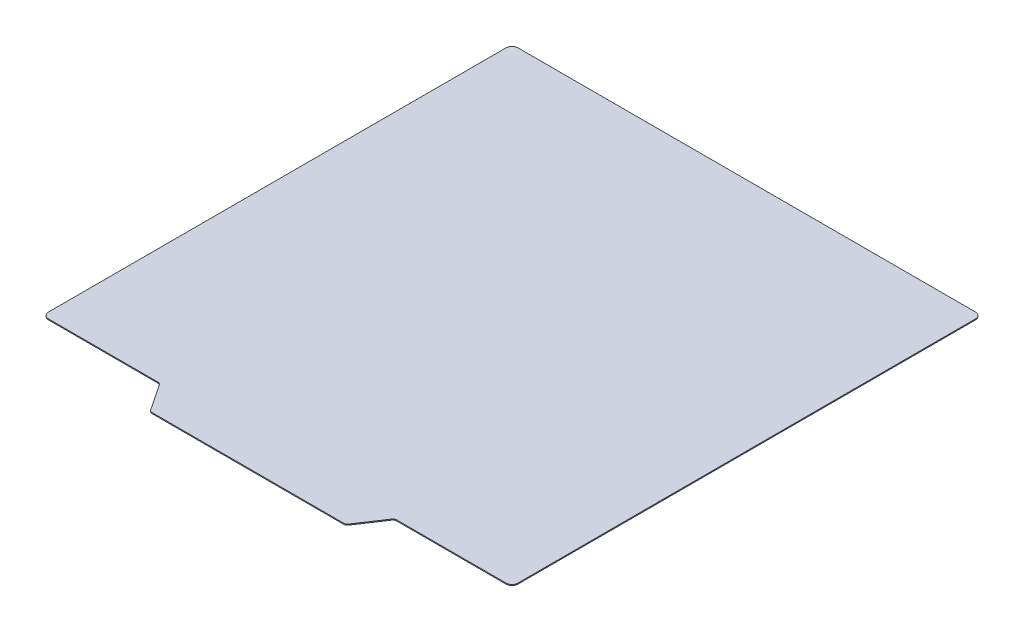
ISO-10303-21;
HEADER;
FILE_DESCRIPTION(('STEP AP214'),'2;1');
FILE_NAME('part.step','',(''),(''),'','','');
FILE_SCHEMA(('AUTOMOTIVE_DESIGN { 1 0 10303 214 1 1 1 1 }'));
ENDSEC;
DATA;
#1=APPLICATION_CONTEXT('core data for automotive mechanical design processes');
#2=APPLICATION_PROTOCOL_DEFINITION('international standard','automotive_design',2000,#1);
#3=PRODUCT_CONTEXT('',#1,'mechanical');
#4=PRODUCT('Part','Part','',(#3));
#5=PRODUCT_RELATED_PRODUCT_CATEGORY('part','',(#4));
#6=PRODUCT_DEFINITION_FORMATION('','',#4);
#7=PRODUCT_DEFINITION_CONTEXT('part definition',#1,'design');
#8=PRODUCT_DEFINITION('design','',#6,#7);
#9=PRODUCT_DEFINITION_SHAPE('','',#8);
#10=(LENGTH_UNIT() NAMED_UNIT(*) SI_UNIT(.MILLI.,.METRE.));
#11=(NAMED_UNIT(*) PLANE_ANGLE_UNIT() SI_UNIT($,.RADIAN.));
#12=(NAMED_UNIT(*) SI_UNIT($,.STERADIAN.) SOLID_ANGLE_UNIT());
#13=UNCERTAINTY_MEASURE_WITH_UNIT(LENGTH_MEASURE(1.E-05),#10,'distance_accuracy_value','');
#14=(GEOMETRIC_REPRESENTATION_CONTEXT(3) GLOBAL_UNCERTAINTY_ASSIGNED_CONTEXT((#13)) GLOBAL_UNIT_ASSIGNED_CONTEXT((#10,
#11,#12)) REPRESENTATION_CONTEXT('',''));
#15=CARTESIAN_POINT('',(0.,0.,0.));
#16=DIRECTION('',(0.,0.,1.));
#17=DIRECTION('',(1.,0.,0.));
#18=AXIS2_PLACEMENT_3D('',#15,#16,#17);
#19=CARTESIAN_POINT('',(-117.,0.5,120.));
#20=DIRECTION('',(0.,0.,-1.));
#21=DIRECTION('',(-1.,0.,0.));
#22=AXIS2_PLACEMENT_3D('',#19,#20,#21);
#23=PLANE('',#22);
#24=DIRECTION('',(1.,0.,0.));
#25=VECTOR('',#24,1.);
#26=CARTESIAN_POINT('',(-117.,0.5,120.));
#27=LINE('',#26,#25);
#28=CARTESIAN_POINT('',(61.070367516976,0.5,120.));
#29=VERTEX_POINT('',#28);
#30=CARTESIAN_POINT('',(117.,0.5,120.));
#31=VERTEX_POINT('',#30);
#32=EDGE_CURVE('E158',#29,#31,#27,.T.);
#33=ORIENTED_EDGE('',*,*,#32,.F.);
#34=DIRECTION('',(0.,1.,0.));
#35=VECTOR('',#34,1.);
#36=CARTESIAN_POINT('',(61.070367516976,0.5,120.));
#37=LINE('',#36,#35);
#38=CARTESIAN_POINT('',(61.070367516976,0.,120.));
#39=VERTEX_POINT('',#38);
#40=EDGE_CURVE('E204',#29,#39,#37,.F.);
#41=ORIENTED_EDGE('',*,*,#40,.T.);
#42=DIRECTION('',(1.,0.,0.));
#43=VECTOR('',#42,1.);
#44=CARTESIAN_POINT('',(-117.,0.,120.));
#45=LINE('',#44,#43);
#46=CARTESIAN_POINT('',(117.,0.,120.));
#47=VERTEX_POINT('',#46);
#48=EDGE_CURVE('E224',#39,#47,#45,.T.);
#49=ORIENTED_EDGE('',*,*,#48,.T.);
#50=DIRECTION('',(0.,-1.,0.));
#51=VECTOR('',#50,1.);
#52=CARTESIAN_POINT('',(117.,0.5,120.));
#53=LINE('',#52,#51);
#54=EDGE_CURVE('E175',#31,#47,#53,.T.);
#55=ORIENTED_EDGE('',*,*,#54,.F.);
#56=EDGE_LOOP('',(#33,#41,#49,#55));
#57=FACE_BOUND('',#56,.T.);
#58=ADVANCED_FACE('F32',(#57),#23,.F.);
#59=CARTESIAN_POINT('',(-117.,0.5,117.));
#60=DIRECTION('',(0.,-1.,0.));
#61=DIRECTION('',(0.,0.,-1.));
#62=AXIS2_PLACEMENT_3D('',#59,#60,#61);
#63=CYLINDRICAL_SURFACE('',#62,2.9999999999999);
#64=CARTESIAN_POINT('',(-117.,0.,117.));
#65=DIRECTION('',(0.,1.,0.));
#66=DIRECTION('',(0.,0.,1.));
#67=AXIS2_PLACEMENT_3D('',#64,#65,#66);
#68=CIRCLE('',#67,2.9999999999999);
#69=CARTESIAN_POINT('',(-120.,0.,117.));
#70=VERTEX_POINT('',#69);
#71=CARTESIAN_POINT('',(-117.,0.,120.));
#72=VERTEX_POINT('',#71);
#73=EDGE_CURVE('E173',#70,#72,#68,.T.);
#74=ORIENTED_EDGE('',*,*,#73,.T.);
#75=DIRECTION('',(0.,-1.,0.));
#76=VECTOR('',#75,1.);
#77=CARTESIAN_POINT('',(-117.,0.5,120.));
#78=LINE('',#77,#76);
#79=CARTESIAN_POINT('',(-117.,0.5,120.));
#80=VERTEX_POINT('',#79);
#81=EDGE_CURVE('E152',#80,#72,#78,.T.);
#82=ORIENTED_EDGE('',*,*,#81,.F.);
#83=CARTESIAN_POINT('',(-117.,0.5,117.));
#84=DIRECTION('',(0.,1.,0.));
#85=DIRECTION('',(0.,0.,1.));
#86=AXIS2_PLACEMENT_3D('',#83,#84,#85);
#87=CIRCLE('',#86,2.9999999999999);
#88=CARTESIAN_POINT('',(-120.,0.5,117.));
#89=VERTEX_POINT('',#88);
#90=EDGE_CURVE('E161',#89,#80,#87,.T.);
#91=ORIENTED_EDGE('',*,*,#90,.F.);
#92=DIRECTION('',(0.,-1.,0.));
#93=VECTOR('',#92,1.);
#94=CARTESIAN_POINT('',(-120.,0.5,117.));
#95=LINE('',#94,#93);
#96=EDGE_CURVE('E248',#89,#70,#95,.T.);
#97=ORIENTED_EDGE('',*,*,#96,.T.);
#98=EDGE_LOOP('',(#74,#82,#91,#97));
#99=FACE_BOUND('',#98,.T.);
#100=ADVANCED_FACE('F171',(#99),#63,.T.);
#101=CARTESIAN_POINT('',(-61.070367516976,0.,120.));
#102=VERTEX_POINT('',#101);
#103=EDGE_CURVE('E250',#72,#102,#45,.T.);
#104=ORIENTED_EDGE('',*,*,#103,.T.);
#105=DIRECTION('',(0.,1.,0.));
#106=VECTOR('',#105,1.);
#107=CARTESIAN_POINT('',(-61.070367516976,0.5,120.));
#108=LINE('',#107,#106);
#109=CARTESIAN_POINT('',(-61.070367516976,0.5,120.));
#110=VERTEX_POINT('',#109);
#111=EDGE_CURVE('E155',#102,#110,#108,.T.);
#112=ORIENTED_EDGE('',*,*,#111,.T.);
#113=EDGE_CURVE('E148',#80,#110,#27,.T.);
#114=ORIENTED_EDGE('',*,*,#113,.F.);
#115=ORIENTED_EDGE('',*,*,#81,.T.);
#116=EDGE_LOOP('',(#104,#112,#114,#115));
#117=FACE_BOUND('',#116,.T.);
#118=ADVANCED_FACE('F150',(#117),#23,.F.);
#119=CARTESIAN_POINT('',(117.,0.5,117.));
#120=DIRECTION('',(0.,-1.,0.));
#121=DIRECTION('',(0.,0.,-1.));
#122=AXIS2_PLACEMENT_3D('',#119,#120,#121);
#123=CYLINDRICAL_SURFACE('',#122,2.9999999999999);
#124=CARTESIAN_POINT('',(117.,0.,117.));
#125=DIRECTION('',(0.,1.,0.));
#126=DIRECTION('',(0.,0.,1.));
#127=AXIS2_PLACEMENT_3D('',#124,#125,#126);
#128=CIRCLE('',#127,2.9999999999999);
#129=CARTESIAN_POINT('',(120.,0.,117.));
#130=VERTEX_POINT('',#129);
#131=EDGE_CURVE('E252',#47,#130,#128,.T.);
#132=ORIENTED_EDGE('',*,*,#131,.T.);
#133=DIRECTION('',(0.,-1.,0.));
#134=VECTOR('',#133,1.);
#135=CARTESIAN_POINT('',(120.,0.5,117.));
#136=LINE('',#135,#134);
#137=CARTESIAN_POINT('',(120.,0.5,117.));
#138=VERTEX_POINT('',#137);
#139=EDGE_CURVE('E180',#138,#130,#136,.T.);
#140=ORIENTED_EDGE('',*,*,#139,.F.);
#141=CARTESIAN_POINT('',(117.,0.5,117.));
#142=DIRECTION('',(0.,1.,0.));
#143=DIRECTION('',(0.,0.,1.));
#144=AXIS2_PLACEMENT_3D('',#141,#142,#143);
#145=CIRCLE('',#144,2.9999999999999);
#146=EDGE_CURVE('E157',#31,#138,#145,.T.);
#147=ORIENTED_EDGE('',*,*,#146,.F.);
#148=ORIENTED_EDGE('',*,*,#54,.T.);
#149=EDGE_LOOP('',(#132,#140,#147,#148));
#150=FACE_BOUND('',#149,.T.);
#151=ADVANCED_FACE('F296',(#150),#123,.T.);
#152=CARTESIAN_POINT('',(120.,0.5,117.));
#153=DIRECTION('',(-1.,0.,0.));
#154=DIRECTION('',(0.,0.,1.));
#155=AXIS2_PLACEMENT_3D('',#152,#153,#154);
#156=PLANE('',#155);
#157=DIRECTION('',(0.,0.,-1.));
#158=VECTOR('',#157,1.);
#159=CARTESIAN_POINT('',(120.,0.,117.));
#160=LINE('',#159,#158);
#161=CARTESIAN_POINT('',(120.,0.,-117.));
#162=VERTEX_POINT('',#161);
#163=EDGE_CURVE('E254',#130,#162,#160,.T.);
#164=ORIENTED_EDGE('',*,*,#163,.T.);
#165=DIRECTION('',(0.,-1.,0.));
#166=VECTOR('',#165,1.);
#167=CARTESIAN_POINT('',(120.,0.5,-117.));
#168=LINE('',#167,#166);
#169=CARTESIAN_POINT('',(120.,0.5,-117.));
#170=VERTEX_POINT('',#169);
#171=EDGE_CURVE('E273',#170,#162,#168,.T.);
#172=ORIENTED_EDGE('',*,*,#171,.F.);
#173=DIRECTION('',(0.,0.,-1.));
#174=VECTOR('',#173,1.);
#175=CARTESIAN_POINT('',(120.,0.5,117.));
#176=LINE('',#175,#174);
#177=EDGE_CURVE('E239',#138,#170,#176,.T.);
#178=ORIENTED_EDGE('',*,*,#177,.F.);
#179=ORIENTED_EDGE('',*,*,#139,.T.);
#180=EDGE_LOOP('',(#164,#172,#178,#179));
#181=FACE_BOUND('',#180,.T.);
#182=ADVANCED_FACE('F280',(#181),#156,.F.);
#183=CARTESIAN_POINT('',(117.,0.5,-117.));
#184=DIRECTION('',(0.,-1.,0.));
#185=DIRECTION('',(0.,0.,-1.));
#186=AXIS2_PLACEMENT_3D('',#183,#184,#185);
#187=CYLINDRICAL_SURFACE('',#186,2.9999999999999);
#188=CARTESIAN_POINT('',(117.,0.,-117.));
#189=DIRECTION('',(0.,1.,0.));
#190=DIRECTION('',(0.,0.,1.));
#191=AXIS2_PLACEMENT_3D('',#188,#189,#190);
#192=CIRCLE('',#191,2.9999999999999);
#193=CARTESIAN_POINT('',(117.,0.,-120.));
#194=VERTEX_POINT('',#193);
#195=EDGE_CURVE('E256',#162,#194,#192,.T.);
#196=ORIENTED_EDGE('',*,*,#195,.T.);
#197=DIRECTION('',(0.,-1.,0.));
#198=VECTOR('',#197,1.);
#199=CARTESIAN_POINT('',(117.,0.5,-120.));
#200=LINE('',#199,#198);
#201=CARTESIAN_POINT('',(117.,0.5,-120.));
#202=VERTEX_POINT('',#201);
#203=EDGE_CURVE('E270',#202,#194,#200,.T.);
#204=ORIENTED_EDGE('',*,*,#203,.F.);
#205=CARTESIAN_POINT('',(117.,0.5,-117.));
#206=DIRECTION('',(0.,1.,0.));
#207=DIRECTION('',(0.,0.,1.));
#208=AXIS2_PLACEMENT_3D('',#205,#206,#207);
#209=CIRCLE('',#208,2.9999999999999);
#210=EDGE_CURVE('E241',#170,#202,#209,.T.);
#211=ORIENTED_EDGE('',*,*,#210,.F.);
#212=ORIENTED_EDGE('',*,*,#171,.T.);
#213=EDGE_LOOP('',(#196,#204,#211,#212));
#214=FACE_BOUND('',#213,.T.);
#215=ADVANCED_FACE('F288',(#214),#187,.T.);
#216=CARTESIAN_POINT('',(117.,0.5,-120.));
#217=DIRECTION('',(0.,0.,1.));
#218=DIRECTION('',(1.,0.,0.));
#219=AXIS2_PLACEMENT_3D('',#216,#217,#218);
#220=PLANE('',#219);
#221=DIRECTION('',(-1.,0.,0.));
#222=VECTOR('',#221,1.);
#223=CARTESIAN_POINT('',(117.,0.,-120.));
#224=LINE('',#223,#222);
#225=CARTESIAN_POINT('',(-117.,0.,-120.));
#226=VERTEX_POINT('',#225);
#227=EDGE_CURVE('E258',#194,#226,#224,.T.);
#228=ORIENTED_EDGE('',*,*,#227,.T.);
#229=DIRECTION('',(0.,-1.,0.));
#230=VECTOR('',#229,1.);
#231=CARTESIAN_POINT('',(-117.,0.5,-120.));
#232=LINE('',#231,#230);
#233=CARTESIAN_POINT('',(-117.,0.5,-120.));
#234=VERTEX_POINT('',#233);
#235=EDGE_CURVE('E267',#234,#226,#232,.T.);
#236=ORIENTED_EDGE('',*,*,#235,.F.);
#237=DIRECTION('',(-1.,0.,0.));
#238=VECTOR('',#237,1.);
#239=CARTESIAN_POINT('',(117.,0.5,-120.));
#240=LINE('',#239,#238);
#241=EDGE_CURVE('E243',#202,#234,#240,.T.);
#242=ORIENTED_EDGE('',*,*,#241,.F.);
#243=ORIENTED_EDGE('',*,*,#203,.T.);
#244=EDGE_LOOP('',(#228,#236,#242,#243));
#245=FACE_BOUND('',#244,.T.);
#246=ADVANCED_FACE('F292',(#245),#220,.F.);
#247=CARTESIAN_POINT('',(-117.,0.5,-117.));
#248=DIRECTION('',(0.,-1.,0.));
#249=DIRECTION('',(0.,0.,-1.));
#250=AXIS2_PLACEMENT_3D('',#247,#248,#249);
#251=CYLINDRICAL_SURFACE('',#250,2.9999999999999);
#252=CARTESIAN_POINT('',(-117.,0.,-117.));
#253=DIRECTION('',(0.,1.,0.));
#254=DIRECTION('',(0.,0.,1.));
#255=AXIS2_PLACEMENT_3D('',#252,#253,#254);
#256=CIRCLE('',#255,2.9999999999999);
#257=CARTESIAN_POINT('',(-120.,0.,-117.));
#258=VERTEX_POINT('',#257);
#259=EDGE_CURVE('E260',#226,#258,#256,.T.);
#260=ORIENTED_EDGE('',*,*,#259,.T.);
#261=DIRECTION('',(0.,-1.,0.));
#262=VECTOR('',#261,1.);
#263=CARTESIAN_POINT('',(-120.,0.5,-117.));
#264=LINE('',#263,#262);
#265=CARTESIAN_POINT('',(-120.,0.5,-117.));
#266=VERTEX_POINT('',#265);
#267=EDGE_CURVE('E264',#266,#258,#264,.T.);
#268=ORIENTED_EDGE('',*,*,#267,.F.);
#269=CARTESIAN_POINT('',(-117.,0.5,-117.));
#270=DIRECTION('',(0.,1.,0.));
#271=DIRECTION('',(0.,0.,1.));
#272=AXIS2_PLACEMENT_3D('',#269,#270,#271);
#273=CIRCLE('',#272,2.9999999999999);
#274=EDGE_CURVE('E245',#234,#266,#273,.T.);
#275=ORIENTED_EDGE('',*,*,#274,.F.);
#276=ORIENTED_EDGE('',*,*,#235,.T.);
#277=EDGE_LOOP('',(#260,#268,#275,#276));
#278=FACE_BOUND('',#277,.T.);
#279=ADVANCED_FACE('F352',(#278),#251,.T.);
#280=CARTESIAN_POINT('',(-120.,0.5,-117.));
#281=DIRECTION('',(1.,0.,0.));
#282=DIRECTION('',(0.,0.,-1.));
#283=AXIS2_PLACEMENT_3D('',#280,#281,#282);
#284=PLANE('',#283);
#285=DIRECTION('',(0.,0.,1.));
#286=VECTOR('',#285,1.);
#287=CARTESIAN_POINT('',(-120.,0.,-117.));
#288=LINE('',#287,#286);
#289=EDGE_CURVE('E169',#258,#70,#288,.T.);
#290=ORIENTED_EDGE('',*,*,#289,.T.);
#291=ORIENTED_EDGE('',*,*,#96,.F.);
#292=DIRECTION('',(0.,0.,1.));
#293=VECTOR('',#292,1.);
#294=CARTESIAN_POINT('',(-120.,0.5,-117.));
#295=LINE('',#294,#293);
#296=EDGE_CURVE('E165',#266,#89,#295,.T.);
#297=ORIENTED_EDGE('',*,*,#296,.F.);
#298=ORIENTED_EDGE('',*,*,#267,.T.);
#299=EDGE_LOOP('',(#290,#291,#297,#298));
#300=FACE_BOUND('',#299,.T.);
#301=ADVANCED_FACE('F347',(#300),#284,.F.);
#302=CARTESIAN_POINT('',(-117.,0.5,117.));
#303=DIRECTION('',(0.,1.,0.));
#304=DIRECTION('',(0.,0.,1.));
#305=AXIS2_PLACEMENT_3D('',#302,#303,#304);
#306=PLANE('',#305);
#307=DIRECTION('',(0.554700196225229,0.,0.832050294337844));
#308=VECTOR('',#307,1.);
#309=CARTESIAN_POINT('',(-60.,0.5,120.));
#310=LINE('',#309,#308);
#311=CARTESIAN_POINT('',(-59.4062669283003,0.5,120.89059960755));
#312=VERTEX_POINT('',#311);
#313=CARTESIAN_POINT('',(-50.5937330716997,0.5,134.10940039245));
#314=VERTEX_POINT('',#313);
#315=EDGE_CURVE('E232',#312,#314,#310,.T.);
#316=ORIENTED_EDGE('',*,*,#315,.T.);
#317=CARTESIAN_POINT('',(-48.929632483024,0.5,133.));
#318=DIRECTION('',(0.,1.,0.));
#319=DIRECTION('',(0.,0.,1.));
#320=AXIS2_PLACEMENT_3D('',#317,#318,#319);
#321=CIRCLE('',#320,2.);
#322=CARTESIAN_POINT('',(-48.929632483024,0.5,135.));
#323=VERTEX_POINT('',#322);
#324=EDGE_CURVE('E188',#314,#323,#321,.T.);
#325=ORIENTED_EDGE('',*,*,#324,.T.);
#326=DIRECTION('',(1.,0.,0.));
#327=VECTOR('',#326,1.);
#328=CARTESIAN_POINT('',(-50.,0.5,135.));
#329=LINE('',#328,#327);
#330=CARTESIAN_POINT('',(48.929632483024,0.5,135.));
#331=VERTEX_POINT('',#330);
#332=EDGE_CURVE('E234',#323,#331,#329,.T.);
#333=ORIENTED_EDGE('',*,*,#332,.T.);
#334=CARTESIAN_POINT('',(48.929632483024,0.5,133.));
#335=DIRECTION('',(0.,1.,0.));
#336=DIRECTION('',(0.,0.,1.));
#337=AXIS2_PLACEMENT_3D('',#334,#335,#336);
#338=CIRCLE('',#337,2.);
#339=CARTESIAN_POINT('',(50.5937330716997,0.5,134.10940039245));
#340=VERTEX_POINT('',#339);
#341=EDGE_CURVE('E186',#331,#340,#338,.T.);
#342=ORIENTED_EDGE('',*,*,#341,.T.);
#343=DIRECTION('',(0.554700196225229,0.,-0.832050294337844));
#344=VECTOR('',#343,1.);
#345=CARTESIAN_POINT('',(60.,0.5,120.));
#346=LINE('',#345,#344);
#347=CARTESIAN_POINT('',(59.4062669283003,0.5,120.890599607549));
#348=VERTEX_POINT('',#347);
#349=EDGE_CURVE('E211',#340,#348,#346,.T.);
#350=ORIENTED_EDGE('',*,*,#349,.T.);
#351=CARTESIAN_POINT('',(61.070367516976,0.5,122.));
#352=DIRECTION('',(0.,1.,0.));
#353=DIRECTION('',(0.,0.,1.));
#354=AXIS2_PLACEMENT_3D('',#351,#352,#353);
#355=CIRCLE('',#354,2.);
#356=EDGE_CURVE('E40',#348,#29,#355,.F.);
#357=ORIENTED_EDGE('',*,*,#356,.T.);
#358=ORIENTED_EDGE('',*,*,#32,.T.);
#359=ORIENTED_EDGE('',*,*,#146,.T.);
#360=ORIENTED_EDGE('',*,*,#177,.T.);
#361=ORIENTED_EDGE('',*,*,#210,.T.);
#362=ORIENTED_EDGE('',*,*,#241,.T.);
#363=ORIENTED_EDGE('',*,*,#274,.T.);
#364=ORIENTED_EDGE('',*,*,#296,.T.);
#365=ORIENTED_EDGE('',*,*,#90,.T.);
#366=ORIENTED_EDGE('',*,*,#113,.T.);
#367=CARTESIAN_POINT('',(-61.070367516976,0.5,122.));
#368=DIRECTION('',(0.,1.,0.));
#369=DIRECTION('',(0.,0.,1.));
#370=AXIS2_PLACEMENT_3D('',#367,#368,#369);
#371=CIRCLE('',#370,2.);
#372=EDGE_CURVE('E206',#110,#312,#371,.F.);
#373=ORIENTED_EDGE('',*,*,#372,.T.);
#374=EDGE_LOOP('',(#316,#325,#333,#342,#350,#357,#358,#359,#360,#361,#362,#363,#364,#365,#366,#373));
#375=FACE_BOUND('',#374,.T.);
#376=ADVANCED_FACE('F163',(#375),#306,.T.);
#377=CARTESIAN_POINT('',(-117.,0.,117.));
#378=DIRECTION('',(0.,1.,0.));
#379=DIRECTION('',(0.,0.,1.));
#380=AXIS2_PLACEMENT_3D('',#377,#378,#379);
#381=PLANE('',#380);
#382=DIRECTION('',(-1.,0.,0.));
#383=VECTOR('',#382,1.);
#384=CARTESIAN_POINT('',(-50.,0.,135.));
#385=LINE('',#384,#383);
#386=CARTESIAN_POINT('',(48.929632483024,0.,135.));
#387=VERTEX_POINT('',#386);
#388=CARTESIAN_POINT('',(-48.929632483024,0.,135.));
#389=VERTEX_POINT('',#388);
#390=EDGE_CURVE('E227',#387,#389,#385,.T.);
#391=ORIENTED_EDGE('',*,*,#390,.T.);
#392=CARTESIAN_POINT('',(-48.929632483024,0.,133.));
#393=DIRECTION('',(0.,1.,0.));
#394=DIRECTION('',(0.,0.,1.));
#395=AXIS2_PLACEMENT_3D('',#392,#393,#394);
#396=CIRCLE('',#395,2.);
#397=CARTESIAN_POINT('',(-50.5937330716997,0.,134.10940039245));
#398=VERTEX_POINT('',#397);
#399=EDGE_CURVE('E197',#389,#398,#396,.F.);
#400=ORIENTED_EDGE('',*,*,#399,.T.);
#401=DIRECTION('',(-0.554700196225229,0.,-0.832050294337844));
#402=VECTOR('',#401,1.);
#403=CARTESIAN_POINT('',(-60.,0.,120.));
#404=LINE('',#403,#402);
#405=CARTESIAN_POINT('',(-59.4062669283003,0.,120.89059960755));
#406=VERTEX_POINT('',#405);
#407=EDGE_CURVE('E226',#398,#406,#404,.T.);
#408=ORIENTED_EDGE('',*,*,#407,.T.);
#409=CARTESIAN_POINT('',(-61.070367516976,0.,122.));
#410=DIRECTION('',(0.,1.,0.));
#411=DIRECTION('',(0.,0.,1.));
#412=AXIS2_PLACEMENT_3D('',#409,#410,#411);
#413=CIRCLE('',#412,2.);
#414=EDGE_CURVE('E47',#406,#102,#413,.T.);
#415=ORIENTED_EDGE('',*,*,#414,.T.);
#416=ORIENTED_EDGE('',*,*,#103,.F.);
#417=ORIENTED_EDGE('',*,*,#73,.F.);
#418=ORIENTED_EDGE('',*,*,#289,.F.);
#419=ORIENTED_EDGE('',*,*,#259,.F.);
#420=ORIENTED_EDGE('',*,*,#227,.F.);
#421=ORIENTED_EDGE('',*,*,#195,.F.);
#422=ORIENTED_EDGE('',*,*,#163,.F.);
#423=ORIENTED_EDGE('',*,*,#131,.F.);
#424=ORIENTED_EDGE('',*,*,#48,.F.);
#425=CARTESIAN_POINT('',(61.070367516976,0.,122.));
#426=DIRECTION('',(0.,1.,0.));
#427=DIRECTION('',(0.,0.,1.));
#428=AXIS2_PLACEMENT_3D('',#425,#426,#427);
#429=CIRCLE('',#428,2.);
#430=CARTESIAN_POINT('',(59.4062669283003,0.,120.890599607549));
#431=VERTEX_POINT('',#430);
#432=EDGE_CURVE('E11',#39,#431,#429,.T.);
#433=ORIENTED_EDGE('',*,*,#432,.T.);
#434=DIRECTION('',(-0.554700196225229,0.,0.832050294337844));
#435=VECTOR('',#434,1.);
#436=CARTESIAN_POINT('',(60.,0.,120.));
#437=LINE('',#436,#435);
#438=CARTESIAN_POINT('',(50.5937330716997,0.,134.10940039245));
#439=VERTEX_POINT('',#438);
#440=EDGE_CURVE('E221',#431,#439,#437,.T.);
#441=ORIENTED_EDGE('',*,*,#440,.T.);
#442=CARTESIAN_POINT('',(48.929632483024,0.,133.));
#443=DIRECTION('',(0.,1.,0.));
#444=DIRECTION('',(0.,0.,1.));
#445=AXIS2_PLACEMENT_3D('',#442,#443,#444);
#446=CIRCLE('',#445,2.);
#447=EDGE_CURVE('E195',#439,#387,#446,.F.);
#448=ORIENTED_EDGE('',*,*,#447,.T.);
#449=EDGE_LOOP('',(#391,#400,#408,#415,#416,#417,#418,#419,#420,#421,#422,#423,#424,#433,#441,#448));
#450=FACE_BOUND('',#449,.T.);
#451=ADVANCED_FACE('F220',(#450),#381,.F.);
#452=CARTESIAN_POINT('',(60.,-120.933866224478,120.));
#453=DIRECTION('',(0.832050294337844,0.,0.554700196225229));
#454=DIRECTION('',(0.554700196225229,0.,-0.832050294337844));
#455=AXIS2_PLACEMENT_3D('',#452,#453,#454);
#456=PLANE('',#455);
#457=ORIENTED_EDGE('',*,*,#349,.F.);
#458=DIRECTION('',(0.,1.,0.));
#459=VECTOR('',#458,1.);
#460=CARTESIAN_POINT('',(50.5937330716997,-120.933866224478,134.10940039245));
#461=LINE('',#460,#459);
#462=EDGE_CURVE('E55',#340,#439,#461,.F.);
#463=ORIENTED_EDGE('',*,*,#462,.T.);
#464=ORIENTED_EDGE('',*,*,#440,.F.);
#465=DIRECTION('',(0.,1.,0.));
#466=VECTOR('',#465,1.);
#467=CARTESIAN_POINT('',(59.4062669283003,-120.933866224478,120.890599607549));
#468=LINE('',#467,#466);
#469=EDGE_CURVE('E200',#431,#348,#468,.T.);
#470=ORIENTED_EDGE('',*,*,#469,.T.);
#471=EDGE_LOOP('',(#457,#463,#464,#470));
#472=FACE_BOUND('',#471,.T.);
#473=ADVANCED_FACE('F225',(#472),#456,.T.);
#474=CARTESIAN_POINT('',(-50.,-120.933866224478,135.));
#475=DIRECTION('',(0.,0.,1.));
#476=DIRECTION('',(1.,0.,0.));
#477=AXIS2_PLACEMENT_3D('',#474,#475,#476);
#478=PLANE('',#477);
#479=ORIENTED_EDGE('',*,*,#332,.F.);
#480=DIRECTION('',(0.,1.,0.));
#481=VECTOR('',#480,1.);
#482=CARTESIAN_POINT('',(-48.929632483024,-120.933866224478,135.));
#483=LINE('',#482,#481);
#484=EDGE_CURVE('E193',#323,#389,#483,.F.);
#485=ORIENTED_EDGE('',*,*,#484,.T.);
#486=ORIENTED_EDGE('',*,*,#390,.F.);
#487=DIRECTION('',(0.,1.,0.));
#488=VECTOR('',#487,1.);
#489=CARTESIAN_POINT('',(48.929632483024,-120.933866224478,135.));
#490=LINE('',#489,#488);
#491=EDGE_CURVE('E190',#387,#331,#490,.T.);
#492=ORIENTED_EDGE('',*,*,#491,.T.);
#493=EDGE_LOOP('',(#479,#485,#486,#492));
#494=FACE_BOUND('',#493,.T.);
#495=ADVANCED_FACE('F330',(#494),#478,.T.);
#496=CARTESIAN_POINT('',(-60.,-120.933866224478,120.));
#497=DIRECTION('',(-0.832050294337844,0.,0.554700196225229));
#498=DIRECTION('',(0.554700196225229,0.,0.832050294337844));
#499=AXIS2_PLACEMENT_3D('',#496,#497,#498);
#500=PLANE('',#499);
#501=ORIENTED_EDGE('',*,*,#407,.F.);
#502=DIRECTION('',(0.,1.,0.));
#503=VECTOR('',#502,1.);
#504=CARTESIAN_POINT('',(-50.5937330716997,-120.933866224478,134.10940039245));
#505=LINE('',#504,#503);
#506=EDGE_CURVE('E177',#398,#314,#505,.T.);
#507=ORIENTED_EDGE('',*,*,#506,.T.);
#508=ORIENTED_EDGE('',*,*,#315,.F.);
#509=DIRECTION('',(0.,1.,0.));
#510=VECTOR('',#509,1.);
#511=CARTESIAN_POINT('',(-59.4062669283003,-120.933866224478,120.89059960755));
#512=LINE('',#511,#510);
#513=EDGE_CURVE('E174',#312,#406,#512,.F.);
#514=ORIENTED_EDGE('',*,*,#513,.T.);
#515=EDGE_LOOP('',(#501,#507,#508,#514));
#516=FACE_BOUND('',#515,.T.);
#517=ADVANCED_FACE('F315',(#516),#500,.T.);
#518=CARTESIAN_POINT('',(-48.929632483024,-120.933866224478,133.));
#519=DIRECTION('',(0.,1.,0.));
#520=DIRECTION('',(0.,0.,1.));
#521=AXIS2_PLACEMENT_3D('',#518,#519,#520);
#522=CYLINDRICAL_SURFACE('',#521,2.);
#523=ORIENTED_EDGE('',*,*,#399,.F.);
#524=ORIENTED_EDGE('',*,*,#484,.F.);
#525=ORIENTED_EDGE('',*,*,#324,.F.);
#526=ORIENTED_EDGE('',*,*,#506,.F.);
#527=EDGE_LOOP('',(#523,#524,#525,#526));
#528=FACE_BOUND('',#527,.T.);
#529=ADVANCED_FACE('F311',(#528),#522,.T.);
#530=CARTESIAN_POINT('',(-61.070367516976,0.5,122.));
#531=DIRECTION('',(0.,1.,0.));
#532=DIRECTION('',(0.,0.,1.));
#533=AXIS2_PLACEMENT_3D('',#530,#531,#532);
#534=CYLINDRICAL_SURFACE('',#533,2.);
#535=ORIENTED_EDGE('',*,*,#414,.F.);
#536=ORIENTED_EDGE('',*,*,#513,.F.);
#537=ORIENTED_EDGE('',*,*,#372,.F.);
#538=ORIENTED_EDGE('',*,*,#111,.F.);
#539=EDGE_LOOP('',(#535,#536,#537,#538));
#540=FACE_BOUND('',#539,.T.);
#541=ADVANCED_FACE('F314',(#540),#534,.F.);
#542=CARTESIAN_POINT('',(48.929632483024,-120.933866224478,133.));
#543=DIRECTION('',(0.,1.,0.));
#544=DIRECTION('',(0.,0.,1.));
#545=AXIS2_PLACEMENT_3D('',#542,#543,#544);
#546=CYLINDRICAL_SURFACE('',#545,2.);
#547=ORIENTED_EDGE('',*,*,#447,.F.);
#548=ORIENTED_EDGE('',*,*,#462,.F.);
#549=ORIENTED_EDGE('',*,*,#341,.F.);
#550=ORIENTED_EDGE('',*,*,#491,.F.);
#551=EDGE_LOOP('',(#547,#548,#549,#550));
#552=FACE_BOUND('',#551,.T.);
#553=ADVANCED_FACE('F318',(#552),#546,.T.);
#554=CARTESIAN_POINT('',(61.070367516976,-120.933866224478,122.));
#555=DIRECTION('',(0.,1.,0.));
#556=DIRECTION('',(0.,0.,1.));
#557=AXIS2_PLACEMENT_3D('',#554,#555,#556);
#558=CYLINDRICAL_SURFACE('',#557,2.);
#559=ORIENTED_EDGE('',*,*,#432,.F.);
#560=ORIENTED_EDGE('',*,*,#40,.F.);
#561=ORIENTED_EDGE('',*,*,#356,.F.);
#562=ORIENTED_EDGE('',*,*,#469,.F.);
#563=EDGE_LOOP('',(#559,#560,#561,#562));
#564=FACE_BOUND('',#563,.T.);
#565=ADVANCED_FACE('F34',(#564),#558,.F.);
#566=CLOSED_SHELL('',(#58,#100,#118,#151,#182,#215,#246,#279,#301,#376,#451,#473,#495,#517,#529,
#541,#553,#565));
#567=MANIFOLD_SOLID_BREP('B2',#566);
#568=ADVANCED_BREP_SHAPE_REPRESENTATION('',(#18,#567),#14);
#569=SHAPE_DEFINITION_REPRESENTATION(#9,#568);
ENDSEC;
END-ISO-10303-21;
